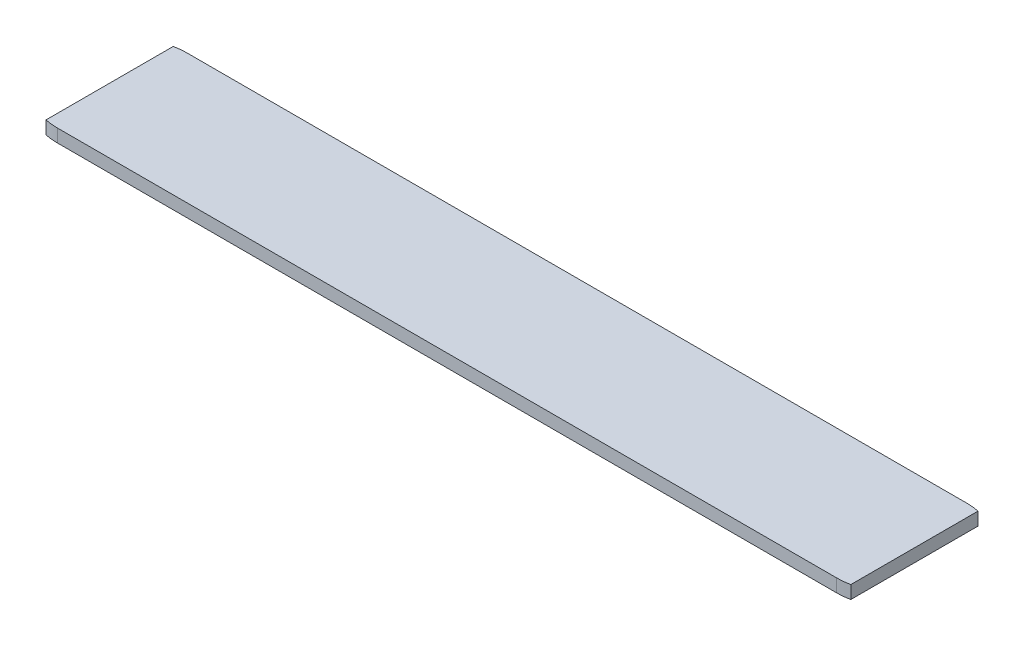
ISO-10303-21;
HEADER;
FILE_DESCRIPTION(('STEP AP214'),'2;1');
FILE_NAME('part.step','',(''),(''),'','','');
FILE_SCHEMA(('AUTOMOTIVE_DESIGN { 1 0 10303 214 1 1 1 1 }'));
ENDSEC;
DATA;
#1=APPLICATION_CONTEXT('core data for automotive mechanical design processes');
#2=APPLICATION_PROTOCOL_DEFINITION('international standard','automotive_design',2000,#1);
#3=PRODUCT_CONTEXT('',#1,'mechanical');
#4=PRODUCT('Part','Part','',(#3));
#5=PRODUCT_RELATED_PRODUCT_CATEGORY('part','',(#4));
#6=PRODUCT_DEFINITION_FORMATION('','',#4);
#7=PRODUCT_DEFINITION_CONTEXT('part definition',#1,'design');
#8=PRODUCT_DEFINITION('design','',#6,#7);
#9=PRODUCT_DEFINITION_SHAPE('','',#8);
#10=(LENGTH_UNIT() NAMED_UNIT(*) SI_UNIT(.MILLI.,.METRE.));
#11=(NAMED_UNIT(*) PLANE_ANGLE_UNIT() SI_UNIT($,.RADIAN.));
#12=(NAMED_UNIT(*) SI_UNIT($,.STERADIAN.) SOLID_ANGLE_UNIT());
#13=UNCERTAINTY_MEASURE_WITH_UNIT(LENGTH_MEASURE(1.E-05),#10,'distance_accuracy_value','');
#14=(GEOMETRIC_REPRESENTATION_CONTEXT(3) GLOBAL_UNCERTAINTY_ASSIGNED_CONTEXT((#13)) GLOBAL_UNIT_ASSIGNED_CONTEXT((#10,
#11,#12)) REPRESENTATION_CONTEXT('',''));
#15=CARTESIAN_POINT('',(0.,0.,0.));
#16=DIRECTION('',(0.,0.,1.));
#17=DIRECTION('',(1.,0.,0.));
#18=AXIS2_PLACEMENT_3D('',#15,#16,#17);
#19=CARTESIAN_POINT('',(-47.625,1.5875,0.));
#20=DIRECTION('',(0.,-1.,0.));
#21=DIRECTION('',(0.,0.,-1.));
#22=AXIS2_PLACEMENT_3D('',#19,#20,#21);
#23=CYLINDRICAL_SURFACE('',#22,7.9375);
#24=DIRECTION('',(0.,-1.,0.));
#25=VECTOR('',#24,1.);
#26=CARTESIAN_POINT('',(-49.2125,1.5875,-7.77712993333659));
#27=LINE('',#26,#25);
#28=CARTESIAN_POINT('',(-49.2125,1.5875,-7.77712993333659));
#29=VERTEX_POINT('',#28);
#30=CARTESIAN_POINT('',(-49.2125,0.,-7.77712993333659));
#31=VERTEX_POINT('',#30);
#32=EDGE_CURVE('E60',#29,#31,#27,.T.);
#33=ORIENTED_EDGE('',*,*,#32,.F.);
#34=CARTESIAN_POINT('',(-47.625,1.5875,0.));
#35=DIRECTION('',(0.,1.,0.));
#36=DIRECTION('',(0.,0.,1.));
#37=AXIS2_PLACEMENT_3D('',#34,#35,#36);
#38=CIRCLE('',#37,7.9375);
#39=CARTESIAN_POINT('',(-47.625,1.5875,-7.9375));
#40=VERTEX_POINT('',#39);
#41=EDGE_CURVE('E186',#40,#29,#38,.T.);
#42=ORIENTED_EDGE('',*,*,#41,.F.);
#43=DIRECTION('',(0.,-1.,0.));
#44=VECTOR('',#43,1.);
#45=CARTESIAN_POINT('',(-47.625,1.5875,-7.9375));
#46=LINE('',#45,#44);
#47=CARTESIAN_POINT('',(-47.625,0.,-7.9375));
#48=VERTEX_POINT('',#47);
#49=EDGE_CURVE('E132',#40,#48,#46,.T.);
#50=ORIENTED_EDGE('',*,*,#49,.T.);
#51=CARTESIAN_POINT('',(-47.625,0.,0.));
#52=DIRECTION('',(0.,1.,0.));
#53=DIRECTION('',(0.,0.,1.));
#54=AXIS2_PLACEMENT_3D('',#51,#52,#53);
#55=CIRCLE('',#54,7.9375);
#56=EDGE_CURVE('E137',#48,#31,#55,.T.);
#57=ORIENTED_EDGE('',*,*,#56,.T.);
#58=EDGE_LOOP('',(#33,#42,#50,#57));
#59=FACE_BOUND('',#58,.T.);
#60=ADVANCED_FACE('F38',(#59),#23,.T.);
#61=DIRECTION('',(0.,-1.,0.));
#62=VECTOR('',#61,1.);
#63=CARTESIAN_POINT('',(-49.2125,1.5875,7.77712993333659));
#64=LINE('',#63,#62);
#65=CARTESIAN_POINT('',(-49.2125,0.,7.77712993333659));
#66=VERTEX_POINT('',#65);
#67=CARTESIAN_POINT('',(-49.2125,1.5875,7.77712993333659));
#68=VERTEX_POINT('',#67);
#69=EDGE_CURVE('E119',#66,#68,#64,.F.);
#70=ORIENTED_EDGE('',*,*,#69,.F.);
#71=CARTESIAN_POINT('',(-47.625,0.,7.9375));
#72=VERTEX_POINT('',#71);
#73=EDGE_CURVE('E142',#66,#72,#55,.T.);
#74=ORIENTED_EDGE('',*,*,#73,.T.);
#75=DIRECTION('',(0.,-1.,0.));
#76=VECTOR('',#75,1.);
#77=CARTESIAN_POINT('',(-47.625,1.5875,7.9375));
#78=LINE('',#77,#76);
#79=CARTESIAN_POINT('',(-47.625,1.5875,7.9375));
#80=VERTEX_POINT('',#79);
#81=EDGE_CURVE('E162',#80,#72,#78,.T.);
#82=ORIENTED_EDGE('',*,*,#81,.F.);
#83=EDGE_CURVE('E151',#68,#80,#38,.T.);
#84=ORIENTED_EDGE('',*,*,#83,.F.);
#85=EDGE_LOOP('',(#70,#74,#82,#84));
#86=FACE_BOUND('',#85,.T.);
#87=ADVANCED_FACE('F196',(#86),#23,.T.);
#88=CARTESIAN_POINT('',(47.625,1.5875,0.));
#89=DIRECTION('',(0.,-1.,0.));
#90=DIRECTION('',(0.,0.,-1.));
#91=AXIS2_PLACEMENT_3D('',#88,#89,#90);
#92=CYLINDRICAL_SURFACE('',#91,7.9375);
#93=DIRECTION('',(0.,-1.,0.));
#94=VECTOR('',#93,1.);
#95=CARTESIAN_POINT('',(49.2125,1.5875,7.77712993333659));
#96=LINE('',#95,#94);
#97=CARTESIAN_POINT('',(49.2125,1.5875,7.77712993333659));
#98=VERTEX_POINT('',#97);
#99=CARTESIAN_POINT('',(49.2125,0.,7.77712993333659));
#100=VERTEX_POINT('',#99);
#101=EDGE_CURVE('E53',#98,#100,#96,.T.);
#102=ORIENTED_EDGE('',*,*,#101,.F.);
#103=CARTESIAN_POINT('',(47.625,1.5875,0.));
#104=DIRECTION('',(0.,1.,0.));
#105=DIRECTION('',(0.,0.,1.));
#106=AXIS2_PLACEMENT_3D('',#103,#104,#105);
#107=CIRCLE('',#106,7.9375);
#108=CARTESIAN_POINT('',(47.625,1.5875,7.9375));
#109=VERTEX_POINT('',#108);
#110=EDGE_CURVE('E115',#109,#98,#107,.T.);
#111=ORIENTED_EDGE('',*,*,#110,.F.);
#112=DIRECTION('',(0.,-1.,0.));
#113=VECTOR('',#112,1.);
#114=CARTESIAN_POINT('',(47.625,1.5875,7.9375));
#115=LINE('',#114,#113);
#116=CARTESIAN_POINT('',(47.625,0.,7.9375));
#117=VERTEX_POINT('',#116);
#118=EDGE_CURVE('E159',#109,#117,#115,.T.);
#119=ORIENTED_EDGE('',*,*,#118,.T.);
#120=CARTESIAN_POINT('',(47.625,0.,0.));
#121=DIRECTION('',(0.,1.,0.));
#122=DIRECTION('',(0.,0.,1.));
#123=AXIS2_PLACEMENT_3D('',#120,#121,#122);
#124=CIRCLE('',#123,7.9375);
#125=EDGE_CURVE('E117',#117,#100,#124,.T.);
#126=ORIENTED_EDGE('',*,*,#125,.T.);
#127=EDGE_LOOP('',(#102,#111,#119,#126));
#128=FACE_BOUND('',#127,.T.);
#129=ADVANCED_FACE('F113',(#128),#92,.T.);
#130=DIRECTION('',(0.,-1.,0.));
#131=VECTOR('',#130,1.);
#132=CARTESIAN_POINT('',(49.2125,1.5875,-7.77712993333659));
#133=LINE('',#132,#131);
#134=CARTESIAN_POINT('',(49.2125,0.,-7.77712993333659));
#135=VERTEX_POINT('',#134);
#136=CARTESIAN_POINT('',(49.2125,1.5875,-7.77712993333659));
#137=VERTEX_POINT('',#136);
#138=EDGE_CURVE('E103',#135,#137,#133,.F.);
#139=ORIENTED_EDGE('',*,*,#138,.F.);
#140=CARTESIAN_POINT('',(47.625,0.,-7.9375));
#141=VERTEX_POINT('',#140);
#142=EDGE_CURVE('E145',#135,#141,#124,.T.);
#143=ORIENTED_EDGE('',*,*,#142,.T.);
#144=DIRECTION('',(0.,-1.,0.));
#145=VECTOR('',#144,1.);
#146=CARTESIAN_POINT('',(47.625,1.5875,-7.9375));
#147=LINE('',#146,#145);
#148=CARTESIAN_POINT('',(47.625,1.5875,-7.9375));
#149=VERTEX_POINT('',#148);
#150=EDGE_CURVE('E155',#149,#141,#147,.T.);
#151=ORIENTED_EDGE('',*,*,#150,.F.);
#152=EDGE_CURVE('E128',#137,#149,#107,.T.);
#153=ORIENTED_EDGE('',*,*,#152,.F.);
#154=EDGE_LOOP('',(#139,#143,#151,#153));
#155=FACE_BOUND('',#154,.T.);
#156=ADVANCED_FACE('F169',(#155),#92,.T.);
#157=CARTESIAN_POINT('',(-47.625,1.5875,0.));
#158=DIRECTION('',(0.,1.,0.));
#159=DIRECTION('',(0.,0.,1.));
#160=AXIS2_PLACEMENT_3D('',#157,#158,#159);
#161=PLANE('',#160);
#162=ORIENTED_EDGE('',*,*,#41,.T.);
#163=DIRECTION('',(0.,0.,1.));
#164=VECTOR('',#163,1.);
#165=CARTESIAN_POINT('',(-49.2125,1.5875,-7.93749999999999));
#166=LINE('',#165,#164);
#167=EDGE_CURVE('E108',#29,#68,#166,.T.);
#168=ORIENTED_EDGE('',*,*,#167,.T.);
#169=ORIENTED_EDGE('',*,*,#83,.T.);
#170=DIRECTION('',(1.,0.,0.));
#171=VECTOR('',#170,1.);
#172=CARTESIAN_POINT('',(-47.625,1.5875,7.9375));
#173=LINE('',#172,#171);
#174=EDGE_CURVE('E124',#80,#109,#173,.T.);
#175=ORIENTED_EDGE('',*,*,#174,.T.);
#176=ORIENTED_EDGE('',*,*,#110,.T.);
#177=DIRECTION('',(0.,0.,-1.));
#178=VECTOR('',#177,1.);
#179=CARTESIAN_POINT('',(49.2125,1.5875,-7.93749999999999));
#180=LINE('',#179,#178);
#181=EDGE_CURVE('E100',#98,#137,#180,.T.);
#182=ORIENTED_EDGE('',*,*,#181,.T.);
#183=ORIENTED_EDGE('',*,*,#152,.T.);
#184=DIRECTION('',(-1.,0.,0.));
#185=VECTOR('',#184,1.);
#186=CARTESIAN_POINT('',(-47.625,1.5875,-7.9375));
#187=LINE('',#186,#185);
#188=EDGE_CURVE('E127',#149,#40,#187,.T.);
#189=ORIENTED_EDGE('',*,*,#188,.T.);
#190=EDGE_LOOP('',(#162,#168,#169,#175,#176,#182,#183,#189));
#191=FACE_BOUND('',#190,.T.);
#192=ADVANCED_FACE('F122',(#191),#161,.T.);
#193=CARTESIAN_POINT('',(-47.625,0.,0.));
#194=DIRECTION('',(0.,1.,0.));
#195=DIRECTION('',(0.,0.,1.));
#196=AXIS2_PLACEMENT_3D('',#193,#194,#195);
#197=PLANE('',#196);
#198=DIRECTION('',(0.,0.,1.));
#199=VECTOR('',#198,1.);
#200=CARTESIAN_POINT('',(-49.2125,0.,0.));
#201=LINE('',#200,#199);
#202=EDGE_CURVE('E11',#31,#66,#201,.T.);
#203=ORIENTED_EDGE('',*,*,#202,.F.);
#204=ORIENTED_EDGE('',*,*,#56,.F.);
#205=DIRECTION('',(-1.,0.,0.));
#206=VECTOR('',#205,1.);
#207=CARTESIAN_POINT('',(-47.625,0.,-7.9375));
#208=LINE('',#207,#206);
#209=EDGE_CURVE('E148',#141,#48,#208,.T.);
#210=ORIENTED_EDGE('',*,*,#209,.F.);
#211=ORIENTED_EDGE('',*,*,#142,.F.);
#212=DIRECTION('',(0.,0.,-1.));
#213=VECTOR('',#212,1.);
#214=CARTESIAN_POINT('',(49.2125,0.,0.));
#215=LINE('',#214,#213);
#216=EDGE_CURVE('E46',#100,#135,#215,.T.);
#217=ORIENTED_EDGE('',*,*,#216,.F.);
#218=ORIENTED_EDGE('',*,*,#125,.F.);
#219=DIRECTION('',(1.,0.,0.));
#220=VECTOR('',#219,1.);
#221=CARTESIAN_POINT('',(-47.625,0.,7.9375));
#222=LINE('',#221,#220);
#223=EDGE_CURVE('E141',#72,#117,#222,.T.);
#224=ORIENTED_EDGE('',*,*,#223,.F.);
#225=ORIENTED_EDGE('',*,*,#73,.F.);
#226=EDGE_LOOP('',(#203,#204,#210,#211,#217,#218,#224,#225));
#227=FACE_BOUND('',#226,.T.);
#228=ADVANCED_FACE('F174',(#227),#197,.F.);
#229=CARTESIAN_POINT('',(-47.625,1.5875,7.9375));
#230=DIRECTION('',(0.,0.,-1.));
#231=DIRECTION('',(-1.,0.,0.));
#232=AXIS2_PLACEMENT_3D('',#229,#230,#231);
#233=PLANE('',#232);
#234=ORIENTED_EDGE('',*,*,#223,.T.);
#235=ORIENTED_EDGE('',*,*,#118,.F.);
#236=ORIENTED_EDGE('',*,*,#174,.F.);
#237=ORIENTED_EDGE('',*,*,#81,.T.);
#238=EDGE_LOOP('',(#234,#235,#236,#237));
#239=FACE_BOUND('',#238,.T.);
#240=ADVANCED_FACE('F195',(#239),#233,.F.);
#241=CARTESIAN_POINT('',(-47.625,1.5875,-7.9375));
#242=DIRECTION('',(0.,0.,1.));
#243=DIRECTION('',(1.,0.,0.));
#244=AXIS2_PLACEMENT_3D('',#241,#242,#243);
#245=PLANE('',#244);
#246=ORIENTED_EDGE('',*,*,#209,.T.);
#247=ORIENTED_EDGE('',*,*,#49,.F.);
#248=ORIENTED_EDGE('',*,*,#188,.F.);
#249=ORIENTED_EDGE('',*,*,#150,.T.);
#250=EDGE_LOOP('',(#246,#247,#248,#249));
#251=FACE_BOUND('',#250,.T.);
#252=ADVANCED_FACE('F203',(#251),#245,.F.);
#253=CARTESIAN_POINT('',(49.2125,-0.9525,-7.93749999999999));
#254=DIRECTION('',(1.,0.,0.));
#255=DIRECTION('',(0.,0.,-1.));
#256=AXIS2_PLACEMENT_3D('',#253,#254,#255);
#257=PLANE('',#256);
#258=ORIENTED_EDGE('',*,*,#101,.T.);
#259=ORIENTED_EDGE('',*,*,#216,.T.);
#260=ORIENTED_EDGE('',*,*,#138,.T.);
#261=ORIENTED_EDGE('',*,*,#181,.F.);
#262=EDGE_LOOP('',(#258,#259,#260,#261));
#263=FACE_BOUND('',#262,.T.);
#264=ADVANCED_FACE('F101',(#263),#257,.T.);
#265=CARTESIAN_POINT('',(-49.2125,-0.9525,-7.93749999999999));
#266=DIRECTION('',(-1.,0.,0.));
#267=DIRECTION('',(0.,0.,1.));
#268=AXIS2_PLACEMENT_3D('',#265,#266,#267);
#269=PLANE('',#268);
#270=ORIENTED_EDGE('',*,*,#32,.T.);
#271=ORIENTED_EDGE('',*,*,#202,.T.);
#272=ORIENTED_EDGE('',*,*,#69,.T.);
#273=ORIENTED_EDGE('',*,*,#167,.F.);
#274=EDGE_LOOP('',(#270,#271,#272,#273));
#275=FACE_BOUND('',#274,.T.);
#276=ADVANCED_FACE('F211',(#275),#269,.T.);
#277=CLOSED_SHELL('',(#60,#87,#129,#156,#192,#228,#240,#252,#264,#276));
#278=MANIFOLD_SOLID_BREP('B2',#277);
#279=ADVANCED_BREP_SHAPE_REPRESENTATION('',(#18,#278),#14);
#280=SHAPE_DEFINITION_REPRESENTATION(#9,#279);
ENDSEC;
END-ISO-10303-21;
